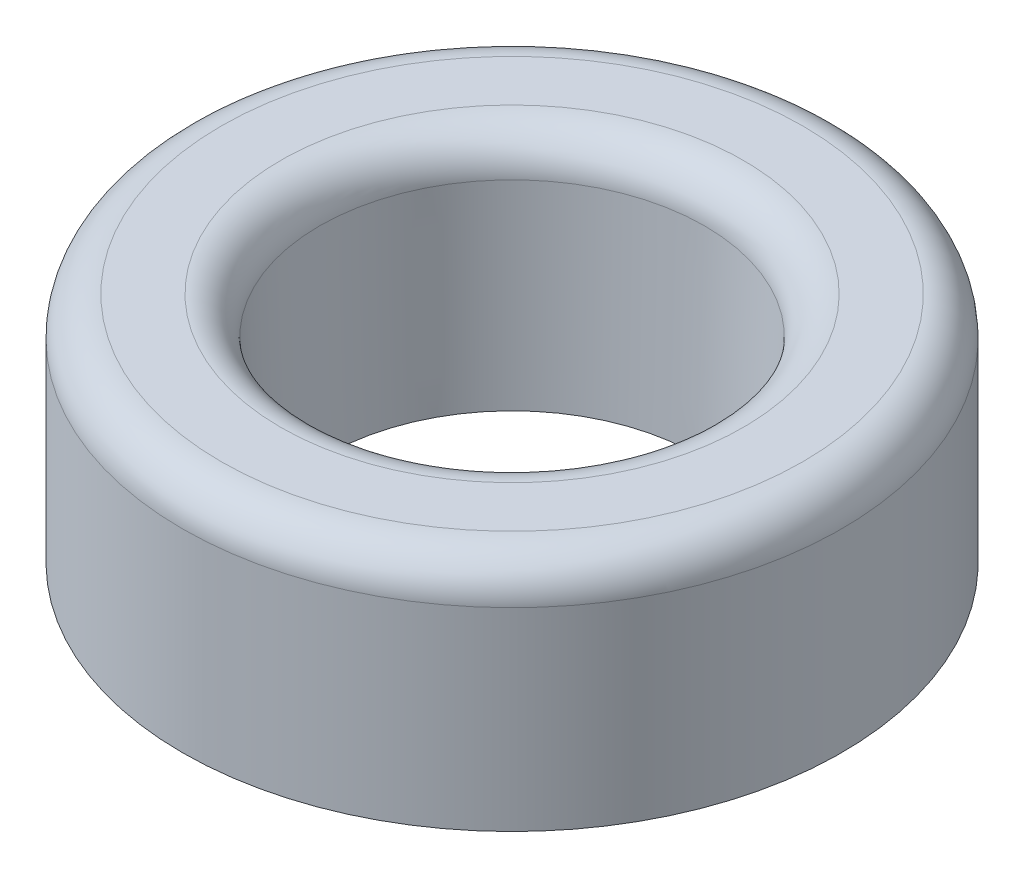
ISO-10303-21;
HEADER;
FILE_DESCRIPTION(('STEP AP214'),'2;1');
FILE_NAME('part.step','',(''),(''),'','','');
FILE_SCHEMA(('AUTOMOTIVE_DESIGN { 1 0 10303 214 1 1 1 1 }'));
ENDSEC;
DATA;
#1=APPLICATION_CONTEXT('core data for automotive mechanical design processes');
#2=APPLICATION_PROTOCOL_DEFINITION('international standard','automotive_design',2000,#1);
#3=PRODUCT_CONTEXT('',#1,'mechanical');
#4=PRODUCT('Part','Part','',(#3));
#5=PRODUCT_RELATED_PRODUCT_CATEGORY('part','',(#4));
#6=PRODUCT_DEFINITION_FORMATION('','',#4);
#7=PRODUCT_DEFINITION_CONTEXT('part definition',#1,'design');
#8=PRODUCT_DEFINITION('design','',#6,#7);
#9=PRODUCT_DEFINITION_SHAPE('','',#8);
#10=(LENGTH_UNIT() NAMED_UNIT(*) SI_UNIT(.MILLI.,.METRE.));
#11=(NAMED_UNIT(*) PLANE_ANGLE_UNIT() SI_UNIT($,.RADIAN.));
#12=(NAMED_UNIT(*) SI_UNIT($,.STERADIAN.) SOLID_ANGLE_UNIT());
#13=UNCERTAINTY_MEASURE_WITH_UNIT(LENGTH_MEASURE(1.E-05),#10,'distance_accuracy_value','');
#14=(GEOMETRIC_REPRESENTATION_CONTEXT(3) GLOBAL_UNCERTAINTY_ASSIGNED_CONTEXT((#13)) GLOBAL_UNIT_ASSIGNED_CONTEXT((#10,
#11,#12)) REPRESENTATION_CONTEXT('',''));
#15=CARTESIAN_POINT('',(0.,0.,0.));
#16=DIRECTION('',(0.,0.,1.));
#17=DIRECTION('',(1.,0.,0.));
#18=AXIS2_PLACEMENT_3D('',#15,#16,#17);
#19=CARTESIAN_POINT('',(-51.1201704164734,6.,0.));
#20=DIRECTION('',(0.,-1.,0.));
#21=DIRECTION('',(0.,0.,-1.));
#22=AXIS2_PLACEMENT_3D('',#19,#20,#21);
#23=CYLINDRICAL_SURFACE('',#22,8.5);
#24=CARTESIAN_POINT('',(-51.1201704164734,5.,0.));
#25=DIRECTION('',(0.,1.,0.));
#26=DIRECTION('',(0.,0.,1.));
#27=AXIS2_PLACEMENT_3D('',#24,#25,#26);
#28=CIRCLE('',#27,8.5);
#29=CARTESIAN_POINT('',(-51.1201704164734,5.,8.5));
#30=VERTEX_POINT('',#29);
#31=EDGE_CURVE('E50',#30,#30,#28,.F.);
#32=ORIENTED_EDGE('',*,*,#31,.T.);
#33=EDGE_LOOP('',(#32));
#34=FACE_BOUND('',#33,.T.);
#35=CARTESIAN_POINT('',(-51.1201704164734,0.,0.));
#36=DIRECTION('',(0.,1.,0.));
#37=DIRECTION('',(0.,0.,1.));
#38=AXIS2_PLACEMENT_3D('',#35,#36,#37);
#39=CIRCLE('',#38,8.5);
#40=CARTESIAN_POINT('',(-51.1201704164734,0.,8.5));
#41=VERTEX_POINT('',#40);
#42=EDGE_CURVE('E61',#41,#41,#39,.T.);
#43=ORIENTED_EDGE('',*,*,#42,.T.);
#44=EDGE_LOOP('',(#43));
#45=FACE_BOUND('',#44,.T.);
#46=ADVANCED_FACE('F37',(#34,#45),#23,.T.);
#47=CARTESIAN_POINT('',(-51.1201704164734,6.,0.));
#48=DIRECTION('',(0.,1.,0.));
#49=DIRECTION('',(0.,0.,1.));
#50=AXIS2_PLACEMENT_3D('',#47,#48,#49);
#51=PLANE('',#50);
#52=CARTESIAN_POINT('',(-51.1201704164734,6.,0.));
#53=DIRECTION('',(0.,1.,0.));
#54=DIRECTION('',(0.,0.,1.));
#55=AXIS2_PLACEMENT_3D('',#52,#53,#54);
#56=CIRCLE('',#55,5.96568877480707);
#57=CARTESIAN_POINT('',(-51.1201704164734,6.,5.96568877480707));
#58=VERTEX_POINT('',#57);
#59=EDGE_CURVE('E10',#58,#58,#56,.F.);
#60=ORIENTED_EDGE('',*,*,#59,.T.);
#61=EDGE_LOOP('',(#60));
#62=FACE_BOUND('',#61,.T.);
#63=CARTESIAN_POINT('',(-51.1201704164734,6.,0.));
#64=DIRECTION('',(0.,1.,0.));
#65=DIRECTION('',(0.,0.,1.));
#66=AXIS2_PLACEMENT_3D('',#63,#64,#65);
#67=CIRCLE('',#66,7.5);
#68=CARTESIAN_POINT('',(-51.1201704164734,6.,7.5));
#69=VERTEX_POINT('',#68);
#70=EDGE_CURVE('E55',#69,#69,#67,.T.);
#71=ORIENTED_EDGE('',*,*,#70,.T.);
#72=EDGE_LOOP('',(#71));
#73=FACE_BOUND('',#72,.T.);
#74=ADVANCED_FACE('F85',(#62,#73),#51,.T.);
#75=CARTESIAN_POINT('',(-51.1201704164734,0.,0.));
#76=DIRECTION('',(0.,1.,0.));
#77=DIRECTION('',(0.,0.,1.));
#78=AXIS2_PLACEMENT_3D('',#75,#76,#77);
#79=PLANE('',#78);
#80=CARTESIAN_POINT('',(-51.1201704164734,0.,0.));
#81=DIRECTION('',(0.,1.,0.));
#82=DIRECTION('',(0.,0.,1.));
#83=AXIS2_PLACEMENT_3D('',#80,#81,#82);
#84=CIRCLE('',#83,4.79047538304951);
#85=CARTESIAN_POINT('',(-51.1201704164734,0.,4.79047538304951));
#86=VERTEX_POINT('',#85);
#87=EDGE_CURVE('E65',#86,#86,#84,.T.);
#88=ORIENTED_EDGE('',*,*,#87,.T.);
#89=EDGE_LOOP('',(#88));
#90=FACE_BOUND('',#89,.T.);
#91=ORIENTED_EDGE('',*,*,#42,.F.);
#92=EDGE_LOOP('',(#91));
#93=FACE_BOUND('',#92,.T.);
#94=ADVANCED_FACE('F70',(#90,#93),#79,.F.);
#95=CARTESIAN_POINT('',(-51.1201704164734,5.,0.));
#96=DIRECTION('',(0.,1.,0.));
#97=DIRECTION('',(0.,0.,1.));
#98=AXIS2_PLACEMENT_3D('',#95,#96,#97);
#99=TOROIDAL_SURFACE('',#98,7.5,1.);
#100=ORIENTED_EDGE('',*,*,#31,.F.);
#101=EDGE_LOOP('',(#100));
#102=FACE_BOUND('',#101,.T.);
#103=ORIENTED_EDGE('',*,*,#70,.F.);
#104=EDGE_LOOP('',(#103));
#105=FACE_BOUND('',#104,.T.);
#106=ADVANCED_FACE('F75',(#102,#105),#99,.T.);
#107=CARTESIAN_POINT('',(-51.1201704164734,6.,0.));
#108=DIRECTION('',(0.,1.,0.));
#109=DIRECTION('',(0.,0.,1.));
#110=AXIS2_PLACEMENT_3D('',#107,#108,#109);
#111=CONICAL_SURFACE('',#110,5.,0.0349065850398866);
#112=CARTESIAN_POINT('',(-51.1201704164734,5.0348994967025,0.));
#113=DIRECTION('',(0.,1.,0.));
#114=DIRECTION('',(0.,0.,1.));
#115=AXIS2_PLACEMENT_3D('',#112,#113,#114);
#116=CIRCLE('',#115,4.96629794778798);
#117=CARTESIAN_POINT('',(-51.1201704164734,5.0348994967025,4.96629794778798));
#118=VERTEX_POINT('',#117);
#119=EDGE_CURVE('E45',#118,#118,#116,.T.);
#120=ORIENTED_EDGE('',*,*,#119,.T.);
#121=EDGE_LOOP('',(#120));
#122=FACE_BOUND('',#121,.T.);
#123=ORIENTED_EDGE('',*,*,#87,.F.);
#124=EDGE_LOOP('',(#123));
#125=FACE_BOUND('',#124,.T.);
#126=ADVANCED_FACE('F73',(#122,#125),#111,.F.);
#127=CARTESIAN_POINT('',(-51.1201704164734,5.,0.));
#128=DIRECTION('',(0.,1.,0.));
#129=DIRECTION('',(0.,0.,1.));
#130=AXIS2_PLACEMENT_3D('',#127,#128,#129);
#131=TOROIDAL_SURFACE('',#130,5.96568877480707,1.);
#132=ORIENTED_EDGE('',*,*,#59,.F.);
#133=EDGE_LOOP('',(#132));
#134=FACE_BOUND('',#133,.T.);
#135=ORIENTED_EDGE('',*,*,#119,.F.);
#136=EDGE_LOOP('',(#135));
#137=FACE_BOUND('',#136,.T.);
#138=ADVANCED_FACE('F39',(#134,#137),#131,.T.);
#139=CLOSED_SHELL('',(#46,#74,#94,#106,#126,#138));
#140=MANIFOLD_SOLID_BREP('B2',#139);
#141=ADVANCED_BREP_SHAPE_REPRESENTATION('',(#18,#140),#14);
#142=SHAPE_DEFINITION_REPRESENTATION(#9,#141);
ENDSEC;
END-ISO-10303-21;
